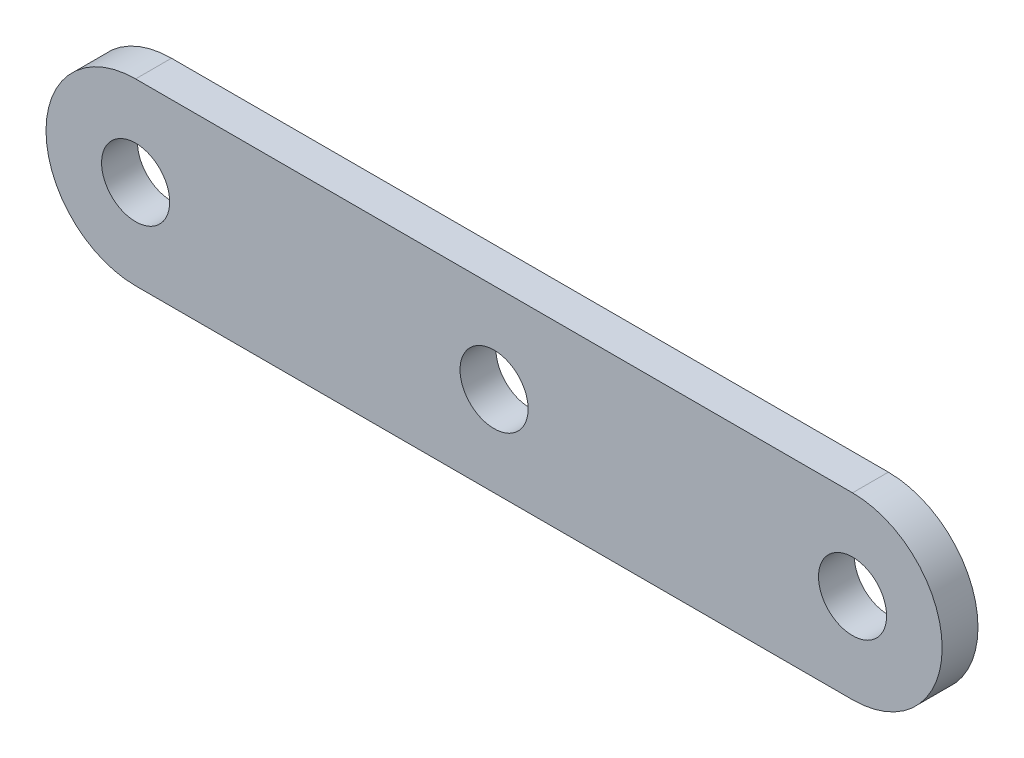
ISO-10303-21;
HEADER;
FILE_DESCRIPTION(('STEP AP214'),'2;1');
FILE_NAME('part.step','',(''),(''),'','','');
FILE_SCHEMA(('AUTOMOTIVE_DESIGN { 1 0 10303 214 1 1 1 1 }'));
ENDSEC;
DATA;
#1=APPLICATION_CONTEXT('core data for automotive mechanical design processes');
#2=APPLICATION_PROTOCOL_DEFINITION('international standard','automotive_design',2000,#1);
#3=PRODUCT_CONTEXT('',#1,'mechanical');
#4=PRODUCT('Part','Part','',(#3));
#5=PRODUCT_RELATED_PRODUCT_CATEGORY('part','',(#4));
#6=PRODUCT_DEFINITION_FORMATION('','',#4);
#7=PRODUCT_DEFINITION_CONTEXT('part definition',#1,'design');
#8=PRODUCT_DEFINITION('design','',#6,#7);
#9=PRODUCT_DEFINITION_SHAPE('','',#8);
#10=(LENGTH_UNIT() NAMED_UNIT(*) SI_UNIT(.MILLI.,.METRE.));
#11=(NAMED_UNIT(*) PLANE_ANGLE_UNIT() SI_UNIT($,.RADIAN.));
#12=(NAMED_UNIT(*) SI_UNIT($,.STERADIAN.) SOLID_ANGLE_UNIT());
#13=UNCERTAINTY_MEASURE_WITH_UNIT(LENGTH_MEASURE(1.E-05),#10,'distance_accuracy_value','');
#14=(GEOMETRIC_REPRESENTATION_CONTEXT(3) GLOBAL_UNCERTAINTY_ASSIGNED_CONTEXT((#13)) GLOBAL_UNIT_ASSIGNED_CONTEXT((#10,
#11,#12)) REPRESENTATION_CONTEXT('',''));
#15=CARTESIAN_POINT('',(0.,0.,0.));
#16=DIRECTION('',(0.,0.,1.));
#17=DIRECTION('',(1.,0.,0.));
#18=AXIS2_PLACEMENT_3D('',#15,#16,#17);
#19=CARTESIAN_POINT('',(-25.4,0.,1.27));
#20=DIRECTION('',(0.,0.,-1.));
#21=DIRECTION('',(-1.,0.,0.));
#22=AXIS2_PLACEMENT_3D('',#19,#20,#21);
#23=CYLINDRICAL_SURFACE('',#22,6.35);
#24=CARTESIAN_POINT('',(-25.4,0.,-1.27));
#25=DIRECTION('',(0.,0.,1.));
#26=DIRECTION('',(1.,0.,0.));
#27=AXIS2_PLACEMENT_3D('',#24,#25,#26);
#28=CIRCLE('',#27,6.35);
#29=CARTESIAN_POINT('',(-25.4,6.35,-1.27));
#30=VERTEX_POINT('',#29);
#31=CARTESIAN_POINT('',(-25.4,-6.35,-1.27));
#32=VERTEX_POINT('',#31);
#33=EDGE_CURVE('E104',#30,#32,#28,.T.);
#34=ORIENTED_EDGE('',*,*,#33,.T.);
#35=DIRECTION('',(0.,0.,-1.));
#36=VECTOR('',#35,1.);
#37=CARTESIAN_POINT('',(-25.4,-6.35,1.27));
#38=LINE('',#37,#36);
#39=CARTESIAN_POINT('',(-25.4,-6.35,1.27));
#40=VERTEX_POINT('',#39);
#41=EDGE_CURVE('E11',#40,#32,#38,.T.);
#42=ORIENTED_EDGE('',*,*,#41,.F.);
#43=CARTESIAN_POINT('',(-25.4,0.,1.27));
#44=DIRECTION('',(0.,0.,1.));
#45=DIRECTION('',(1.,0.,0.));
#46=AXIS2_PLACEMENT_3D('',#43,#44,#45);
#47=CIRCLE('',#46,6.35);
#48=CARTESIAN_POINT('',(-25.4,6.35,1.27));
#49=VERTEX_POINT('',#48);
#50=EDGE_CURVE('E92',#49,#40,#47,.T.);
#51=ORIENTED_EDGE('',*,*,#50,.F.);
#52=DIRECTION('',(0.,0.,-1.));
#53=VECTOR('',#52,1.);
#54=CARTESIAN_POINT('',(-25.4,6.35,1.27));
#55=LINE('',#54,#53);
#56=EDGE_CURVE('E100',#49,#30,#55,.T.);
#57=ORIENTED_EDGE('',*,*,#56,.T.);
#58=EDGE_LOOP('',(#34,#42,#51,#57));
#59=FACE_BOUND('',#58,.T.);
#60=ADVANCED_FACE('F41',(#59),#23,.T.);
#61=CARTESIAN_POINT('',(25.4,-6.34999999999999,1.27));
#62=DIRECTION('',(0.,1.,0.));
#63=DIRECTION('',(-1.,0.,0.));
#64=AXIS2_PLACEMENT_3D('',#61,#62,#63);
#65=PLANE('',#64);
#66=DIRECTION('',(1.,0.,0.));
#67=VECTOR('',#66,1.);
#68=CARTESIAN_POINT('',(25.4,-6.34999999999999,-1.27));
#69=LINE('',#68,#67);
#70=CARTESIAN_POINT('',(25.4,-6.35,-1.27));
#71=VERTEX_POINT('',#70);
#72=EDGE_CURVE('E96',#32,#71,#69,.T.);
#73=ORIENTED_EDGE('',*,*,#72,.T.);
#74=DIRECTION('',(0.,0.,-1.));
#75=VECTOR('',#74,1.);
#76=CARTESIAN_POINT('',(25.4,-6.35,1.27));
#77=LINE('',#76,#75);
#78=CARTESIAN_POINT('',(25.4,-6.35,1.27));
#79=VERTEX_POINT('',#78);
#80=EDGE_CURVE('E49',#79,#71,#77,.T.);
#81=ORIENTED_EDGE('',*,*,#80,.F.);
#82=DIRECTION('',(1.,0.,0.));
#83=VECTOR('',#82,1.);
#84=CARTESIAN_POINT('',(25.4,-6.34999999999999,1.27));
#85=LINE('',#84,#83);
#86=EDGE_CURVE('E87',#40,#79,#85,.T.);
#87=ORIENTED_EDGE('',*,*,#86,.F.);
#88=ORIENTED_EDGE('',*,*,#41,.T.);
#89=EDGE_LOOP('',(#73,#81,#87,#88));
#90=FACE_BOUND('',#89,.T.);
#91=ADVANCED_FACE('F95',(#90),#65,.F.);
#92=CARTESIAN_POINT('',(25.4,0.,1.27));
#93=DIRECTION('',(0.,0.,-1.));
#94=DIRECTION('',(-1.,0.,0.));
#95=AXIS2_PLACEMENT_3D('',#92,#93,#94);
#96=CYLINDRICAL_SURFACE('',#95,6.35);
#97=CARTESIAN_POINT('',(25.4,0.,-1.27));
#98=DIRECTION('',(0.,0.,1.));
#99=DIRECTION('',(1.,0.,0.));
#100=AXIS2_PLACEMENT_3D('',#97,#98,#99);
#101=CIRCLE('',#100,6.35);
#102=CARTESIAN_POINT('',(25.4,6.35000000000001,-1.27));
#103=VERTEX_POINT('',#102);
#104=EDGE_CURVE('E74',#71,#103,#101,.T.);
#105=ORIENTED_EDGE('',*,*,#104,.T.);
#106=DIRECTION('',(0.,0.,-1.));
#107=VECTOR('',#106,1.);
#108=CARTESIAN_POINT('',(25.4,6.35000000000001,1.27));
#109=LINE('',#108,#107);
#110=CARTESIAN_POINT('',(25.4,6.35000000000001,1.27));
#111=VERTEX_POINT('',#110);
#112=EDGE_CURVE('E97',#111,#103,#109,.T.);
#113=ORIENTED_EDGE('',*,*,#112,.F.);
#114=CARTESIAN_POINT('',(25.4,0.,1.27));
#115=DIRECTION('',(0.,0.,1.));
#116=DIRECTION('',(1.,0.,0.));
#117=AXIS2_PLACEMENT_3D('',#114,#115,#116);
#118=CIRCLE('',#117,6.35);
#119=EDGE_CURVE('E90',#79,#111,#118,.T.);
#120=ORIENTED_EDGE('',*,*,#119,.F.);
#121=ORIENTED_EDGE('',*,*,#80,.T.);
#122=EDGE_LOOP('',(#105,#113,#120,#121));
#123=FACE_BOUND('',#122,.T.);
#124=ADVANCED_FACE('F98',(#123),#96,.T.);
#125=CARTESIAN_POINT('',(25.4,6.35000000000001,1.27));
#126=DIRECTION('',(0.,-1.,0.));
#127=DIRECTION('',(1.,0.,0.));
#128=AXIS2_PLACEMENT_3D('',#125,#126,#127);
#129=PLANE('',#128);
#130=DIRECTION('',(-1.,0.,0.));
#131=VECTOR('',#130,1.);
#132=CARTESIAN_POINT('',(25.4,6.35000000000001,-1.27));
#133=LINE('',#132,#131);
#134=EDGE_CURVE('E80',#103,#30,#133,.T.);
#135=ORIENTED_EDGE('',*,*,#134,.T.);
#136=ORIENTED_EDGE('',*,*,#56,.F.);
#137=DIRECTION('',(-1.,0.,0.));
#138=VECTOR('',#137,1.);
#139=CARTESIAN_POINT('',(25.4,6.35000000000001,1.27));
#140=LINE('',#139,#138);
#141=EDGE_CURVE('E57',#111,#49,#140,.T.);
#142=ORIENTED_EDGE('',*,*,#141,.F.);
#143=ORIENTED_EDGE('',*,*,#112,.T.);
#144=EDGE_LOOP('',(#135,#136,#142,#143));
#145=FACE_BOUND('',#144,.T.);
#146=ADVANCED_FACE('F112',(#145),#129,.F.);
#147=CARTESIAN_POINT('',(-25.4,0.,1.27));
#148=DIRECTION('',(0.,0.,1.));
#149=DIRECTION('',(1.,0.,0.));
#150=AXIS2_PLACEMENT_3D('',#147,#148,#149);
#151=PLANE('',#150);
#152=CARTESIAN_POINT('',(0.,0.,1.27));
#153=DIRECTION('',(0.,0.,1.));
#154=DIRECTION('',(1.,0.,0.));
#155=AXIS2_PLACEMENT_3D('',#152,#153,#154);
#156=CIRCLE('',#155,2.413);
#157=CARTESIAN_POINT('',(2.413,0.,1.27));
#158=VERTEX_POINT('',#157);
#159=EDGE_CURVE('E130',#158,#158,#156,.T.);
#160=ORIENTED_EDGE('',*,*,#159,.F.);
#161=EDGE_LOOP('',(#160));
#162=FACE_BOUND('',#161,.T.);
#163=CARTESIAN_POINT('',(25.4,0.,1.27));
#164=DIRECTION('',(0.,0.,1.));
#165=DIRECTION('',(1.,0.,0.));
#166=AXIS2_PLACEMENT_3D('',#163,#164,#165);
#167=CIRCLE('',#166,2.413);
#168=CARTESIAN_POINT('',(27.813,0.,1.27));
#169=VERTEX_POINT('',#168);
#170=EDGE_CURVE('E124',#169,#169,#167,.T.);
#171=ORIENTED_EDGE('',*,*,#170,.F.);
#172=EDGE_LOOP('',(#171));
#173=FACE_BOUND('',#172,.T.);
#174=CARTESIAN_POINT('',(-25.4,0.,1.27));
#175=DIRECTION('',(0.,0.,1.));
#176=DIRECTION('',(1.,0.,0.));
#177=AXIS2_PLACEMENT_3D('',#174,#175,#176);
#178=CIRCLE('',#177,2.413);
#179=CARTESIAN_POINT('',(-22.987,0.,1.27));
#180=VERTEX_POINT('',#179);
#181=EDGE_CURVE('E118',#180,#180,#178,.T.);
#182=ORIENTED_EDGE('',*,*,#181,.F.);
#183=EDGE_LOOP('',(#182));
#184=FACE_BOUND('',#183,.T.);
#185=ORIENTED_EDGE('',*,*,#50,.T.);
#186=ORIENTED_EDGE('',*,*,#86,.T.);
#187=ORIENTED_EDGE('',*,*,#119,.T.);
#188=ORIENTED_EDGE('',*,*,#141,.T.);
#189=EDGE_LOOP('',(#185,#186,#187,#188));
#190=FACE_BOUND('',#189,.T.);
#191=ADVANCED_FACE('F88',(#162,#173,#184,#190),#151,.T.);
#192=CARTESIAN_POINT('',(-25.4,0.,-1.27));
#193=DIRECTION('',(0.,0.,1.));
#194=DIRECTION('',(1.,0.,0.));
#195=AXIS2_PLACEMENT_3D('',#192,#193,#194);
#196=PLANE('',#195);
#197=CARTESIAN_POINT('',(0.,0.,-1.27));
#198=DIRECTION('',(0.,0.,1.));
#199=DIRECTION('',(1.,0.,0.));
#200=AXIS2_PLACEMENT_3D('',#197,#198,#199);
#201=CIRCLE('',#200,2.413);
#202=CARTESIAN_POINT('',(2.413,0.,-1.27));
#203=VERTEX_POINT('',#202);
#204=EDGE_CURVE('E121',#203,#203,#201,.T.);
#205=ORIENTED_EDGE('',*,*,#204,.T.);
#206=EDGE_LOOP('',(#205));
#207=FACE_BOUND('',#206,.T.);
#208=CARTESIAN_POINT('',(25.4,0.,-1.27));
#209=DIRECTION('',(0.,0.,1.));
#210=DIRECTION('',(1.,0.,0.));
#211=AXIS2_PLACEMENT_3D('',#208,#209,#210);
#212=CIRCLE('',#211,2.413);
#213=CARTESIAN_POINT('',(27.813,0.,-1.27));
#214=VERTEX_POINT('',#213);
#215=EDGE_CURVE('E127',#214,#214,#212,.T.);
#216=ORIENTED_EDGE('',*,*,#215,.T.);
#217=EDGE_LOOP('',(#216));
#218=FACE_BOUND('',#217,.T.);
#219=CARTESIAN_POINT('',(-25.4,0.,-1.27));
#220=DIRECTION('',(0.,0.,1.));
#221=DIRECTION('',(1.,0.,0.));
#222=AXIS2_PLACEMENT_3D('',#219,#220,#221);
#223=CIRCLE('',#222,2.413);
#224=CARTESIAN_POINT('',(-22.987,0.,-1.27));
#225=VERTEX_POINT('',#224);
#226=EDGE_CURVE('E107',#225,#225,#223,.T.);
#227=ORIENTED_EDGE('',*,*,#226,.T.);
#228=EDGE_LOOP('',(#227));
#229=FACE_BOUND('',#228,.T.);
#230=ORIENTED_EDGE('',*,*,#33,.F.);
#231=ORIENTED_EDGE('',*,*,#134,.F.);
#232=ORIENTED_EDGE('',*,*,#104,.F.);
#233=ORIENTED_EDGE('',*,*,#72,.F.);
#234=EDGE_LOOP('',(#230,#231,#232,#233));
#235=FACE_BOUND('',#234,.T.);
#236=ADVANCED_FACE('F115',(#207,#218,#229,#235),#196,.F.);
#237=CARTESIAN_POINT('',(-25.4,0.,-1.27));
#238=DIRECTION('',(0.,0.,1.));
#239=DIRECTION('',(1.,0.,0.));
#240=AXIS2_PLACEMENT_3D('',#237,#238,#239);
#241=CYLINDRICAL_SURFACE('',#240,2.413);
#242=ORIENTED_EDGE('',*,*,#226,.F.);
#243=EDGE_LOOP('',(#242));
#244=FACE_BOUND('',#243,.T.);
#245=ORIENTED_EDGE('',*,*,#181,.T.);
#246=EDGE_LOOP('',(#245));
#247=FACE_BOUND('',#246,.T.);
#248=ADVANCED_FACE('F152',(#244,#247),#241,.F.);
#249=CARTESIAN_POINT('',(25.4,0.,-1.27));
#250=DIRECTION('',(0.,0.,1.));
#251=DIRECTION('',(1.,0.,0.));
#252=AXIS2_PLACEMENT_3D('',#249,#250,#251);
#253=CYLINDRICAL_SURFACE('',#252,2.413);
#254=ORIENTED_EDGE('',*,*,#215,.F.);
#255=EDGE_LOOP('',(#254));
#256=FACE_BOUND('',#255,.T.);
#257=ORIENTED_EDGE('',*,*,#170,.T.);
#258=EDGE_LOOP('',(#257));
#259=FACE_BOUND('',#258,.T.);
#260=ADVANCED_FACE('F141',(#256,#259),#253,.F.);
#261=CARTESIAN_POINT('',(0.,0.,-1.27));
#262=DIRECTION('',(0.,0.,1.));
#263=DIRECTION('',(1.,0.,0.));
#264=AXIS2_PLACEMENT_3D('',#261,#262,#263);
#265=CYLINDRICAL_SURFACE('',#264,2.413);
#266=ORIENTED_EDGE('',*,*,#204,.F.);
#267=EDGE_LOOP('',(#266));
#268=FACE_BOUND('',#267,.T.);
#269=ORIENTED_EDGE('',*,*,#159,.T.);
#270=EDGE_LOOP('',(#269));
#271=FACE_BOUND('',#270,.T.);
#272=ADVANCED_FACE('F138',(#268,#271),#265,.F.);
#273=CLOSED_SHELL('',(#60,#91,#124,#146,#191,#236,#248,#260,#272));
#274=MANIFOLD_SOLID_BREP('B2',#273);
#275=ADVANCED_BREP_SHAPE_REPRESENTATION('',(#18,#274),#14);
#276=SHAPE_DEFINITION_REPRESENTATION(#9,#275);
ENDSEC;
END-ISO-10303-21;
